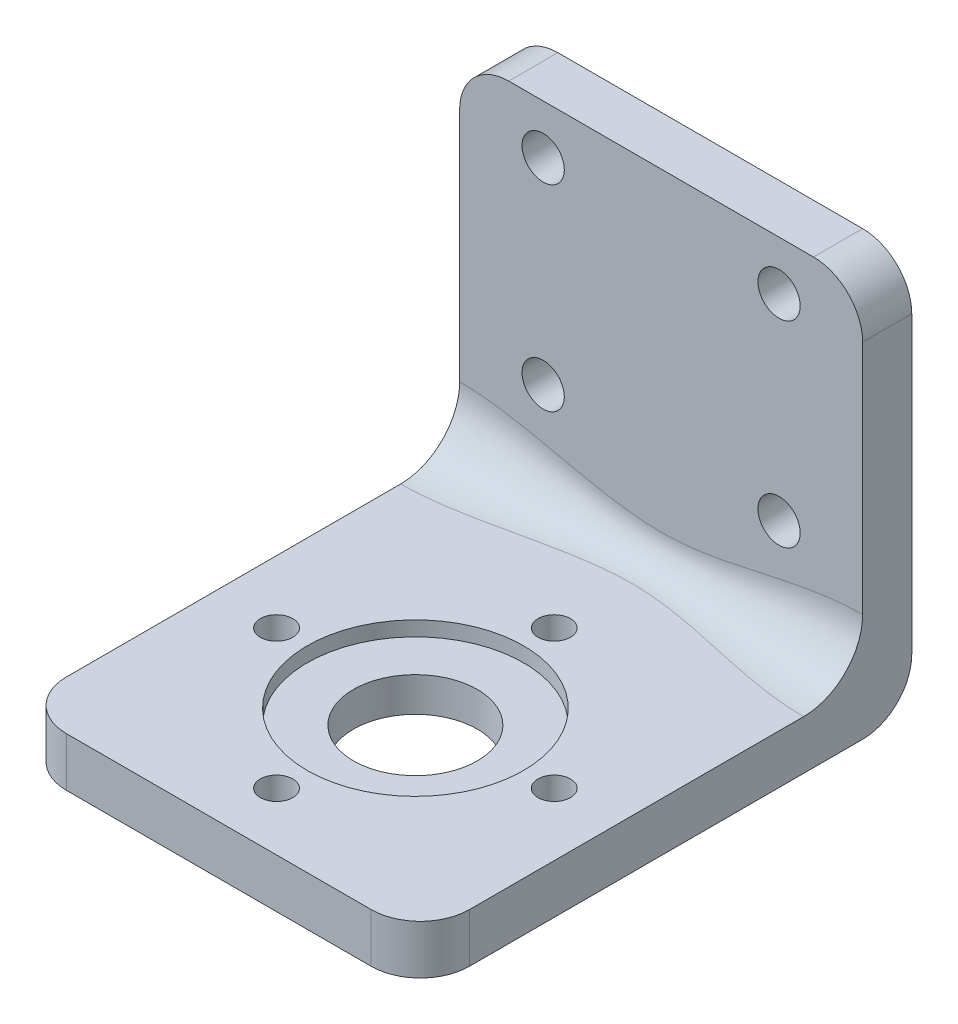
ISO-10303-21;
HEADER;
FILE_DESCRIPTION(('STEP AP214'),'2;1');
FILE_NAME('part.step','',(''),(''),'','','');
FILE_SCHEMA(('AUTOMOTIVE_DESIGN { 1 0 10303 214 1 1 1 1 }'));
ENDSEC;
DATA;
#1=APPLICATION_CONTEXT('core data for automotive mechanical design processes');
#2=APPLICATION_PROTOCOL_DEFINITION('international standard','automotive_design',2000,#1);
#3=PRODUCT_CONTEXT('',#1,'mechanical');
#4=PRODUCT('Part','Part','',(#3));
#5=PRODUCT_RELATED_PRODUCT_CATEGORY('part','',(#4));
#6=PRODUCT_DEFINITION_FORMATION('','',#4);
#7=PRODUCT_DEFINITION_CONTEXT('part definition',#1,'design');
#8=PRODUCT_DEFINITION('design','',#6,#7);
#9=PRODUCT_DEFINITION_SHAPE('','',#8);
#10=(LENGTH_UNIT() NAMED_UNIT(*) SI_UNIT(.MILLI.,.METRE.));
#11=(NAMED_UNIT(*) PLANE_ANGLE_UNIT() SI_UNIT($,.RADIAN.));
#12=(NAMED_UNIT(*) SI_UNIT($,.STERADIAN.) SOLID_ANGLE_UNIT());
#13=UNCERTAINTY_MEASURE_WITH_UNIT(LENGTH_MEASURE(1.E-05),#10,'distance_accuracy_value','');
#14=(GEOMETRIC_REPRESENTATION_CONTEXT(3) GLOBAL_UNCERTAINTY_ASSIGNED_CONTEXT((#13)) GLOBAL_UNIT_ASSIGNED_CONTEXT((#10,
#11,#12)) REPRESENTATION_CONTEXT('',''));
#15=CARTESIAN_POINT('',(0.,0.,0.));
#16=DIRECTION('',(0.,0.,1.));
#17=DIRECTION('',(1.,0.,0.));
#18=AXIS2_PLACEMENT_3D('',#15,#16,#17);
#19=CARTESIAN_POINT('',(0.,5.,0.));
#20=DIRECTION('',(0.,-1.,0.));
#21=DIRECTION('',(0.,0.,-1.));
#22=AXIS2_PLACEMENT_3D('',#19,#20,#21);
#23=PLANE('',#22);
#24=DIRECTION('',(0.,0.,-1.));
#25=VECTOR('',#24,1.);
#26=CARTESIAN_POINT('',(20.5,5.,-28.));
#27=LINE('',#26,#25);
#28=CARTESIAN_POINT('',(20.5,5.,15.));
#29=VERTEX_POINT('',#28);
#30=CARTESIAN_POINT('',(20.5,5.,-19.));
#31=VERTEX_POINT('',#30);
#32=EDGE_CURVE('E165',#29,#31,#27,.T.);
#33=ORIENTED_EDGE('',*,*,#32,.T.);
#34=CARTESIAN_POINT('',(102.5,5.,-19.));
#35=CARTESIAN_POINT('',(75.1666666666666,5.,-19.));
#36=CARTESIAN_POINT('',(47.8333333333333,5.,-19.));
#37=CARTESIAN_POINT('',(20.5,5.,-19.));
#38=CARTESIAN_POINT('',(13.6666666666667,5.,-19.));
#39=CARTESIAN_POINT('',(6.83333333333333,5.,-22.));
#40=CARTESIAN_POINT('',(0.,5.,-22.));
#41=CARTESIAN_POINT('',(-6.83333333333334,5.,-22.));
#42=CARTESIAN_POINT('',(-13.6666666666667,5.,-19.));
#43=CARTESIAN_POINT('',(-20.5,5.,-19.));
#44=CARTESIAN_POINT('',(-47.8333333333333,5.,-19.));
#45=CARTESIAN_POINT('',(-75.1666666666667,5.,-19.));
#46=CARTESIAN_POINT('',(-102.5,5.,-19.));
#47=(BOUNDED_CURVE() B_SPLINE_CURVE(3,(#34,#35,#36,#37,#38,#39,#40,#41,#42,#43,#44,#45,#46),
.UNSPECIFIED.,.F.,.F.) B_SPLINE_CURVE_WITH_KNOTS((4,3,3,3,4),(-0.1025,-0.0205,0.,0.0205,0.1025),
.UNSPECIFIED.) CURVE() GEOMETRIC_REPRESENTATION_ITEM() RATIONAL_B_SPLINE_CURVE((1.,1.,1.,1.,1.,
1.,1.,1.,1.,1.,1.,1.,1.)) REPRESENTATION_ITEM(''));
#48=CARTESIAN_POINT('',(-20.5,5.,-19.));
#49=VERTEX_POINT('',#48);
#50=EDGE_CURVE('E223',#31,#49,#47,.T.);
#51=ORIENTED_EDGE('',*,*,#50,.T.);
#52=DIRECTION('',(0.,0.,1.));
#53=VECTOR('',#52,1.);
#54=CARTESIAN_POINT('',(-20.5,5.,20.));
#55=LINE('',#54,#53);
#56=CARTESIAN_POINT('',(-20.5,5.,15.));
#57=VERTEX_POINT('',#56);
#58=EDGE_CURVE('E173',#49,#57,#55,.T.);
#59=ORIENTED_EDGE('',*,*,#58,.T.);
#60=CARTESIAN_POINT('',(-15.5,5.,15.));
#61=DIRECTION('',(0.,-1.,0.));
#62=DIRECTION('',(0.,0.,-1.));
#63=AXIS2_PLACEMENT_3D('',#60,#61,#62);
#64=CIRCLE('',#63,5.);
#65=CARTESIAN_POINT('',(-15.5,5.,20.));
#66=VERTEX_POINT('',#65);
#67=EDGE_CURVE('E194',#57,#66,#64,.F.);
#68=ORIENTED_EDGE('',*,*,#67,.T.);
#69=DIRECTION('',(1.,0.,0.));
#70=VECTOR('',#69,1.);
#71=CARTESIAN_POINT('',(20.5,5.,20.));
#72=LINE('',#71,#70);
#73=CARTESIAN_POINT('',(15.5,5.,20.));
#74=VERTEX_POINT('',#73);
#75=EDGE_CURVE('E176',#66,#74,#72,.T.);
#76=ORIENTED_EDGE('',*,*,#75,.T.);
#77=CARTESIAN_POINT('',(15.5,5.,15.));
#78=DIRECTION('',(0.,-1.,0.));
#79=DIRECTION('',(0.,0.,-1.));
#80=AXIS2_PLACEMENT_3D('',#77,#78,#79);
#81=CIRCLE('',#80,5.);
#82=EDGE_CURVE('E196',#74,#29,#81,.F.);
#83=ORIENTED_EDGE('',*,*,#82,.T.);
#84=EDGE_LOOP('',(#33,#51,#59,#68,#76,#83));
#85=FACE_BOUND('',#84,.T.);
#86=CARTESIAN_POINT('',(0.,5.,0.));
#87=DIRECTION('',(0.,1.,0.));
#88=DIRECTION('',(0.,0.,1.));
#89=AXIS2_PLACEMENT_3D('',#86,#87,#88);
#90=CIRCLE('',#89,11.);
#91=CARTESIAN_POINT('',(0.,5.,11.));
#92=VERTEX_POINT('',#91);
#93=EDGE_CURVE('E304',#92,#92,#90,.T.);
#94=ORIENTED_EDGE('',*,*,#93,.F.);
#95=EDGE_LOOP('',(#94));
#96=FACE_BOUND('',#95,.T.);
#97=CARTESIAN_POINT('',(0.,5.,-14.125));
#98=DIRECTION('',(0.,1.,0.));
#99=DIRECTION('',(0.,0.,1.));
#100=AXIS2_PLACEMENT_3D('',#97,#98,#99);
#101=CIRCLE('',#100,1.65);
#102=CARTESIAN_POINT('',(0.,5.,-12.475));
#103=VERTEX_POINT('',#102);
#104=EDGE_CURVE('E310',#103,#103,#101,.T.);
#105=ORIENTED_EDGE('',*,*,#104,.F.);
#106=EDGE_LOOP('',(#105));
#107=FACE_BOUND('',#106,.T.);
#108=CARTESIAN_POINT('',(14.125,5.,0.));
#109=DIRECTION('',(0.,1.,0.));
#110=DIRECTION('',(0.,0.,1.));
#111=AXIS2_PLACEMENT_3D('',#108,#109,#110);
#112=CIRCLE('',#111,1.65);
#113=CARTESIAN_POINT('',(14.125,5.,1.65000000000005));
#114=VERTEX_POINT('',#113);
#115=EDGE_CURVE('E314',#114,#114,#112,.T.);
#116=ORIENTED_EDGE('',*,*,#115,.F.);
#117=EDGE_LOOP('',(#116));
#118=FACE_BOUND('',#117,.T.);
#119=CARTESIAN_POINT('',(0.,5.,14.125));
#120=DIRECTION('',(0.,1.,0.));
#121=DIRECTION('',(0.,0.,1.));
#122=AXIS2_PLACEMENT_3D('',#119,#120,#121);
#123=CIRCLE('',#122,1.65);
#124=CARTESIAN_POINT('',(0.,5.,15.775));
#125=VERTEX_POINT('',#124);
#126=EDGE_CURVE('E320',#125,#125,#123,.T.);
#127=ORIENTED_EDGE('',*,*,#126,.F.);
#128=EDGE_LOOP('',(#127));
#129=FACE_BOUND('',#128,.T.);
#130=CARTESIAN_POINT('',(-14.125,5.,-1.47951521733478E-13));
#131=DIRECTION('',(0.,1.,0.));
#132=DIRECTION('',(0.,0.,1.));
#133=AXIS2_PLACEMENT_3D('',#130,#131,#132);
#134=CIRCLE('',#133,1.65);
#135=CARTESIAN_POINT('',(-14.125,5.,1.64999999999985));
#136=VERTEX_POINT('',#135);
#137=EDGE_CURVE('E326',#136,#136,#134,.T.);
#138=ORIENTED_EDGE('',*,*,#137,.F.);
#139=EDGE_LOOP('',(#138));
#140=FACE_BOUND('',#139,.T.);
#141=ADVANCED_FACE('F49',(#85,#96,#107,#118,#129,#140),#23,.F.);
#142=CARTESIAN_POINT('',(0.,0.,0.));
#143=DIRECTION('',(0.,-1.,0.));
#144=DIRECTION('',(0.,0.,-1.));
#145=AXIS2_PLACEMENT_3D('',#142,#143,#144);
#146=PLANE('',#145);
#147=DIRECTION('',(0.,0.,-1.));
#148=VECTOR('',#147,1.);
#149=CARTESIAN_POINT('',(20.5,0.,-28.));
#150=LINE('',#149,#148);
#151=CARTESIAN_POINT('',(20.5,0.,15.));
#152=VERTEX_POINT('',#151);
#153=CARTESIAN_POINT('',(20.5,0.,-25.));
#154=VERTEX_POINT('',#153);
#155=EDGE_CURVE('E162',#152,#154,#150,.T.);
#156=ORIENTED_EDGE('',*,*,#155,.F.);
#157=CARTESIAN_POINT('',(15.5,0.,15.));
#158=DIRECTION('',(0.,-1.,0.));
#159=DIRECTION('',(0.,0.,-1.));
#160=AXIS2_PLACEMENT_3D('',#157,#158,#159);
#161=CIRCLE('',#160,5.);
#162=CARTESIAN_POINT('',(15.5,0.,20.));
#163=VERTEX_POINT('',#162);
#164=EDGE_CURVE('E145',#152,#163,#161,.T.);
#165=ORIENTED_EDGE('',*,*,#164,.T.);
#166=DIRECTION('',(1.,0.,0.));
#167=VECTOR('',#166,1.);
#168=CARTESIAN_POINT('',(20.5,0.,20.));
#169=LINE('',#168,#167);
#170=CARTESIAN_POINT('',(-15.5,0.,20.));
#171=VERTEX_POINT('',#170);
#172=EDGE_CURVE('E174',#171,#163,#169,.T.);
#173=ORIENTED_EDGE('',*,*,#172,.F.);
#174=CARTESIAN_POINT('',(-15.5,0.,15.));
#175=DIRECTION('',(0.,-1.,0.));
#176=DIRECTION('',(0.,0.,-1.));
#177=AXIS2_PLACEMENT_3D('',#174,#175,#176);
#178=CIRCLE('',#177,5.);
#179=CARTESIAN_POINT('',(-20.5,0.,15.));
#180=VERTEX_POINT('',#179);
#181=EDGE_CURVE('E156',#171,#180,#178,.T.);
#182=ORIENTED_EDGE('',*,*,#181,.T.);
#183=DIRECTION('',(0.,0.,1.));
#184=VECTOR('',#183,1.);
#185=CARTESIAN_POINT('',(-20.5,0.,20.));
#186=LINE('',#185,#184);
#187=CARTESIAN_POINT('',(-20.5,0.,-25.));
#188=VERTEX_POINT('',#187);
#189=EDGE_CURVE('E178',#188,#180,#186,.T.);
#190=ORIENTED_EDGE('',*,*,#189,.F.);
#191=DIRECTION('',(-1.,0.,0.));
#192=VECTOR('',#191,1.);
#193=CARTESIAN_POINT('',(0.,0.,-25.));
#194=LINE('',#193,#192);
#195=EDGE_CURVE('E166',#188,#154,#194,.F.);
#196=ORIENTED_EDGE('',*,*,#195,.T.);
#197=EDGE_LOOP('',(#156,#165,#173,#182,#190,#196));
#198=FACE_BOUND('',#197,.T.);
#199=CARTESIAN_POINT('',(0.,0.,14.125));
#200=DIRECTION('',(0.,1.,0.));
#201=DIRECTION('',(0.,0.,1.));
#202=AXIS2_PLACEMENT_3D('',#199,#200,#201);
#203=CIRCLE('',#202,1.65);
#204=CARTESIAN_POINT('',(0.,0.,15.775));
#205=VERTEX_POINT('',#204);
#206=EDGE_CURVE('E323',#205,#205,#203,.T.);
#207=ORIENTED_EDGE('',*,*,#206,.T.);
#208=EDGE_LOOP('',(#207));
#209=FACE_BOUND('',#208,.T.);
#210=CARTESIAN_POINT('',(0.,0.,-14.125));
#211=DIRECTION('',(0.,1.,0.));
#212=DIRECTION('',(0.,0.,1.));
#213=AXIS2_PLACEMENT_3D('',#210,#211,#212);
#214=CIRCLE('',#213,1.65);
#215=CARTESIAN_POINT('',(0.,0.,-12.475));
#216=VERTEX_POINT('',#215);
#217=EDGE_CURVE('E311',#216,#216,#214,.T.);
#218=ORIENTED_EDGE('',*,*,#217,.T.);
#219=EDGE_LOOP('',(#218));
#220=FACE_BOUND('',#219,.T.);
#221=CARTESIAN_POINT('',(14.125,0.,0.));
#222=DIRECTION('',(0.,1.,0.));
#223=DIRECTION('',(0.,0.,1.));
#224=AXIS2_PLACEMENT_3D('',#221,#222,#223);
#225=CIRCLE('',#224,1.65);
#226=CARTESIAN_POINT('',(14.125,0.,1.65000000000005));
#227=VERTEX_POINT('',#226);
#228=EDGE_CURVE('E317',#227,#227,#225,.T.);
#229=ORIENTED_EDGE('',*,*,#228,.T.);
#230=EDGE_LOOP('',(#229));
#231=FACE_BOUND('',#230,.T.);
#232=CARTESIAN_POINT('',(-14.125,0.,-1.47951521733478E-13));
#233=DIRECTION('',(0.,1.,0.));
#234=DIRECTION('',(0.,0.,1.));
#235=AXIS2_PLACEMENT_3D('',#232,#233,#234);
#236=CIRCLE('',#235,1.65);
#237=CARTESIAN_POINT('',(-14.125,0.,1.64999999999985));
#238=VERTEX_POINT('',#237);
#239=EDGE_CURVE('E329',#238,#238,#236,.T.);
#240=ORIENTED_EDGE('',*,*,#239,.T.);
#241=EDGE_LOOP('',(#240));
#242=FACE_BOUND('',#241,.T.);
#243=CARTESIAN_POINT('',(0.,0.,0.));
#244=DIRECTION('',(0.,1.,0.));
#245=DIRECTION('',(0.,0.,1.));
#246=AXIS2_PLACEMENT_3D('',#243,#244,#245);
#247=CIRCLE('',#246,6.3);
#248=CARTESIAN_POINT('',(0.,0.,6.3));
#249=VERTEX_POINT('',#248);
#250=EDGE_CURVE('E335',#249,#249,#247,.T.);
#251=ORIENTED_EDGE('',*,*,#250,.T.);
#252=EDGE_LOOP('',(#251));
#253=FACE_BOUND('',#252,.T.);
#254=ADVANCED_FACE('F169',(#198,#209,#220,#231,#242,#253),#146,.T.);
#255=CARTESIAN_POINT('',(-20.5,5.,20.));
#256=DIRECTION('',(1.,0.,0.));
#257=DIRECTION('',(0.,0.,-1.));
#258=AXIS2_PLACEMENT_3D('',#255,#256,#257);
#259=PLANE('',#258);
#260=ORIENTED_EDGE('',*,*,#58,.F.);
#261=CARTESIAN_POINT('',(-20.5,5.,-19.));
#262=CARTESIAN_POINT('',(-20.5,4.99998185319682,-19.1687563537996));
#263=CARTESIAN_POINT('',(-20.5,5.00711891499115,-19.3375101029604));
#264=CARTESIAN_POINT('',(-20.5,5.0355723897027,-19.6738102077422));
#265=CARTESIAN_POINT('',(-20.5,5.05688812244296,-19.8413566208916));
#266=CARTESIAN_POINT('',(-20.5,5.11354648216325,-20.1739305915643));
#267=CARTESIAN_POINT('',(-20.5,5.14887849800397,-20.3389599567175));
#268=CARTESIAN_POINT('',(-20.5,5.2333124043798,-20.6654554225954));
#269=CARTESIAN_POINT('',(-20.5,5.28241412682549,-20.8269215667911));
#270=CARTESIAN_POINT('',(-20.5,5.39405728527187,-21.1451937792472));
#271=CARTESIAN_POINT('',(-20.5,5.45660279266905,-21.3019984193779));
#272=CARTESIAN_POINT('',(-20.5,5.59470522710627,-21.609838703918));
#273=CARTESIAN_POINT('',(-20.5,5.67026693815366,-21.7608722021616));
#274=CARTESIAN_POINT('',(-20.5,5.83380474458107,-22.0559558653354));
#275=CARTESIAN_POINT('',(-20.5,5.92177418699462,-22.2000097174649));
#276=CARTESIAN_POINT('',(-20.5,6.10956546883596,-22.4802455879841));
#277=CARTESIAN_POINT('',(-20.5,6.20939141773711,-22.6164248525774));
#278=CARTESIAN_POINT('',(-20.5,6.42014206607361,-22.8798647142634));
#279=CARTESIAN_POINT('',(-20.5,6.53106472468132,-23.0071269440195));
#280=CARTESIAN_POINT('',(-20.5,6.76323562781716,-23.2518556596365));
#281=CARTESIAN_POINT('',(-20.5,6.88448387343979,-23.369322144459));
#282=CARTESIAN_POINT('',(-20.5,7.13649077482601,-23.5936658863369));
#283=CARTESIAN_POINT('',(-20.5,7.26725292764923,-23.7005392151821));
#284=CARTESIAN_POINT('',(-20.5,7.53727079643672,-23.902851913268));
#285=CARTESIAN_POINT('',(-20.5,7.67652355004665,-23.9982952363547));
#286=CARTESIAN_POINT('',(-20.5,7.96265332207706,-24.1771619594503));
#287=CARTESIAN_POINT('',(-20.5,8.109534502019,-24.2605787029136));
#288=CARTESIAN_POINT('',(-20.5,8.40974844632281,-24.41470773829));
#289=CARTESIAN_POINT('',(-20.5,8.56307884602161,-24.4854246374504));
#290=CARTESIAN_POINT('',(-20.5,8.87511425492029,-24.6136707230681));
#291=CARTESIAN_POINT('',(-20.5,9.03381771578294,-24.6712036721947));
#292=CARTESIAN_POINT('',(-20.5,9.35544410149749,-24.7726842059971));
#293=CARTESIAN_POINT('',(-20.5,9.51836600183349,-24.8166350563782));
#294=CARTESIAN_POINT('',(-20.5,9.89895584736189,-24.9022615118628));
#295=CARTESIAN_POINT('',(-20.5,10.1177870427925,-24.9389122329387));
#296=CARTESIAN_POINT('',(-20.5,10.4477910012266,-24.975560615492));
#297=CARTESIAN_POINT('',(-20.5,10.5580293043512,-24.9847221184334));
#298=CARTESIAN_POINT('',(-20.5,10.7788360343227,-24.9969410558667));
#299=CARTESIAN_POINT('',(-20.5,10.8894044376644,-24.9999989150633));
#300=CARTESIAN_POINT('',(-20.5,11.,-25.));
#301=B_SPLINE_CURVE_WITH_KNOTS('',3,(#261,#262,#263,#264,#265,#266,#267,#268,#269,#270,#271,
#272,#273,#274,#275,#276,#277,#278,#279,#280,#281,#282,#283,#284,#285,#286,#287,#288,#289,#290,
#291,#292,#293,#294,#295,#296,#297,#298,#299,#300),.UNSPECIFIED.,.F.,.F.,(4,2,2,2,2,2,2,2,2,2,2,
2,2,2,2,2,2,2,2,4),(0.,0.506114535320528,1.01220479314574,1.51791264023729,2.02361431432596,
2.52946935446871,3.03551071606248,3.54128176496753,4.04722862885895,4.55308261308199,
5.05893665092544,5.56497757590775,6.07084294341928,6.57698723429621,7.08294753366735,
7.58876325278334,8.09445725782553,8.75855077526273,9.09026407937799,9.42195430136597),.UNSPECIFIED.);
#302=CARTESIAN_POINT('',(-20.5,11.,-25.));
#303=VERTEX_POINT('',#302);
#304=EDGE_CURVE('E66',#49,#303,#301,.T.);
#305=ORIENTED_EDGE('',*,*,#304,.T.);
#306=DIRECTION('',(0.,1.,0.));
#307=VECTOR('',#306,1.);
#308=CARTESIAN_POINT('',(-20.5,-41.3037528561268,-25.));
#309=LINE('',#308,#307);
#310=CARTESIAN_POINT('',(-20.5,35.,-25.));
#311=VERTEX_POINT('',#310);
#312=EDGE_CURVE('E338',#303,#311,#309,.T.);
#313=ORIENTED_EDGE('',*,*,#312,.T.);
#314=DIRECTION('',(0.,0.,1.));
#315=VECTOR('',#314,1.);
#316=CARTESIAN_POINT('',(-20.5,35.,-30.));
#317=LINE('',#316,#315);
#318=CARTESIAN_POINT('',(-20.5,35.,-30.));
#319=VERTEX_POINT('',#318);
#320=EDGE_CURVE('E221',#311,#319,#317,.F.);
#321=ORIENTED_EDGE('',*,*,#320,.T.);
#322=DIRECTION('',(0.,1.,0.));
#323=VECTOR('',#322,1.);
#324=CARTESIAN_POINT('',(-20.5,-41.3037528561268,-30.));
#325=LINE('',#324,#323);
#326=CARTESIAN_POINT('',(-20.5,5.,-30.));
#327=VERTEX_POINT('',#326);
#328=EDGE_CURVE('E342',#327,#319,#325,.T.);
#329=ORIENTED_EDGE('',*,*,#328,.F.);
#330=CARTESIAN_POINT('',(-20.5,5.,-25.));
#331=DIRECTION('',(1.,0.,0.));
#332=DIRECTION('',(0.,0.,-1.));
#333=AXIS2_PLACEMENT_3D('',#330,#331,#332);
#334=CIRCLE('',#333,5.);
#335=EDGE_CURVE('E216',#327,#188,#334,.F.);
#336=ORIENTED_EDGE('',*,*,#335,.T.);
#337=ORIENTED_EDGE('',*,*,#189,.T.);
#338=DIRECTION('',(0.,-1.,0.));
#339=VECTOR('',#338,1.);
#340=CARTESIAN_POINT('',(-20.5,5.,15.));
#341=LINE('',#340,#339);
#342=EDGE_CURVE('E218',#180,#57,#341,.F.);
#343=ORIENTED_EDGE('',*,*,#342,.T.);
#344=EDGE_LOOP('',(#260,#305,#313,#321,#329,#336,#337,#343));
#345=FACE_BOUND('',#344,.T.);
#346=ADVANCED_FACE('F241',(#345),#259,.F.);
#347=CARTESIAN_POINT('',(20.5,5.,20.));
#348=DIRECTION('',(0.,0.,-1.));
#349=DIRECTION('',(-1.,0.,0.));
#350=AXIS2_PLACEMENT_3D('',#347,#348,#349);
#351=PLANE('',#350);
#352=ORIENTED_EDGE('',*,*,#172,.T.);
#353=DIRECTION('',(0.,-1.,0.));
#354=VECTOR('',#353,1.);
#355=CARTESIAN_POINT('',(15.5,5.,20.));
#356=LINE('',#355,#354);
#357=EDGE_CURVE('E150',#163,#74,#356,.F.);
#358=ORIENTED_EDGE('',*,*,#357,.T.);
#359=ORIENTED_EDGE('',*,*,#75,.F.);
#360=DIRECTION('',(0.,-1.,0.));
#361=VECTOR('',#360,1.);
#362=CARTESIAN_POINT('',(-15.5,5.,20.));
#363=LINE('',#362,#361);
#364=EDGE_CURVE('E155',#66,#171,#363,.T.);
#365=ORIENTED_EDGE('',*,*,#364,.T.);
#366=EDGE_LOOP('',(#352,#358,#359,#365));
#367=FACE_BOUND('',#366,.T.);
#368=ADVANCED_FACE('F246',(#367),#351,.F.);
#369=CARTESIAN_POINT('',(20.5,5.,-28.));
#370=DIRECTION('',(-1.,0.,0.));
#371=DIRECTION('',(0.,0.,1.));
#372=AXIS2_PLACEMENT_3D('',#369,#370,#371);
#373=PLANE('',#372);
#374=ORIENTED_EDGE('',*,*,#32,.F.);
#375=DIRECTION('',(0.,-1.,0.));
#376=VECTOR('',#375,1.);
#377=CARTESIAN_POINT('',(20.5,5.,15.));
#378=LINE('',#377,#376);
#379=EDGE_CURVE('E149',#29,#152,#378,.T.);
#380=ORIENTED_EDGE('',*,*,#379,.T.);
#381=ORIENTED_EDGE('',*,*,#155,.T.);
#382=CARTESIAN_POINT('',(20.5,5.,-25.));
#383=DIRECTION('',(-1.,0.,0.));
#384=DIRECTION('',(0.,0.,1.));
#385=AXIS2_PLACEMENT_3D('',#382,#383,#384);
#386=CIRCLE('',#385,5.);
#387=CARTESIAN_POINT('',(20.5,5.,-30.));
#388=VERTEX_POINT('',#387);
#389=EDGE_CURVE('E185',#154,#388,#386,.F.);
#390=ORIENTED_EDGE('',*,*,#389,.T.);
#391=DIRECTION('',(0.,1.,0.));
#392=VECTOR('',#391,1.);
#393=CARTESIAN_POINT('',(20.5,-41.3037528561268,-30.));
#394=LINE('',#393,#392);
#395=CARTESIAN_POINT('',(20.5,35.,-30.));
#396=VERTEX_POINT('',#395);
#397=EDGE_CURVE('E345',#388,#396,#394,.T.);
#398=ORIENTED_EDGE('',*,*,#397,.T.);
#399=DIRECTION('',(0.,0.,-1.));
#400=VECTOR('',#399,1.);
#401=CARTESIAN_POINT('',(20.5,35.,-25.));
#402=LINE('',#401,#400);
#403=CARTESIAN_POINT('',(20.5,35.,-25.));
#404=VERTEX_POINT('',#403);
#405=EDGE_CURVE('E167',#396,#404,#402,.F.);
#406=ORIENTED_EDGE('',*,*,#405,.T.);
#407=DIRECTION('',(0.,1.,0.));
#408=VECTOR('',#407,1.);
#409=CARTESIAN_POINT('',(20.5,-41.3037528561268,-25.));
#410=LINE('',#409,#408);
#411=CARTESIAN_POINT('',(20.5,11.,-25.));
#412=VERTEX_POINT('',#411);
#413=EDGE_CURVE('E343',#412,#404,#410,.T.);
#414=ORIENTED_EDGE('',*,*,#413,.F.);
#415=CARTESIAN_POINT('',(20.5,11.,-25.));
#416=CARTESIAN_POINT('',(20.5,10.8312436462004,-25.0000181468032));
#417=CARTESIAN_POINT('',(20.5,10.6624898970396,-24.9928810850088));
#418=CARTESIAN_POINT('',(20.5,10.3261897922578,-24.9644276102973));
#419=CARTESIAN_POINT('',(20.5,10.1586433791084,-24.943111877557));
#420=CARTESIAN_POINT('',(20.5,9.82606940843566,-24.8864535178368));
#421=CARTESIAN_POINT('',(20.5,9.66104004328253,-24.851121501996));
#422=CARTESIAN_POINT('',(20.5,9.33454457740465,-24.7666875956202));
#423=CARTESIAN_POINT('',(20.5,9.17307843320894,-24.7175858731745));
#424=CARTESIAN_POINT('',(20.5,8.85480622075284,-24.6059427147281));
#425=CARTESIAN_POINT('',(20.5,8.69800158062211,-24.5433972073309));
#426=CARTESIAN_POINT('',(20.5,8.39016129608198,-24.4052947728937));
#427=CARTESIAN_POINT('',(20.5,8.23912779783842,-24.3297330618463));
#428=CARTESIAN_POINT('',(20.5,7.94404413466466,-24.1661952554189));
#429=CARTESIAN_POINT('',(20.5,7.79999028253509,-24.0782258130054));
#430=CARTESIAN_POINT('',(20.5,7.51975441201594,-23.890434531164));
#431=CARTESIAN_POINT('',(20.5,7.38357514742257,-23.7906085822629));
#432=CARTESIAN_POINT('',(20.5,7.12013528573658,-23.5798579339264));
#433=CARTESIAN_POINT('',(20.5,6.99287305598049,-23.4689352753187));
#434=CARTESIAN_POINT('',(20.5,6.74814434036354,-23.2367643721828));
#435=CARTESIAN_POINT('',(20.5,6.63067785554102,-23.1155161265602));
#436=CARTESIAN_POINT('',(20.5,6.40633411366312,-22.863509225174));
#437=CARTESIAN_POINT('',(20.5,6.29946078481791,-22.7327470723508));
#438=CARTESIAN_POINT('',(20.5,6.09714808673204,-22.4627292035633));
#439=CARTESIAN_POINT('',(20.5,6.00170476364533,-22.3234764499534));
#440=CARTESIAN_POINT('',(20.5,5.82283804054973,-22.0373466779229));
#441=CARTESIAN_POINT('',(20.5,5.73942129708636,-21.890465497981));
#442=CARTESIAN_POINT('',(20.5,5.58529226170997,-21.5902515536772));
#443=CARTESIAN_POINT('',(20.5,5.51457536254961,-21.4369211539784));
#444=CARTESIAN_POINT('',(20.5,5.38632927693188,-21.1248857450797));
#445=CARTESIAN_POINT('',(20.5,5.3287963278053,-20.9661822842171));
#446=CARTESIAN_POINT('',(20.5,5.22731579400287,-20.6445558985025));
#447=CARTESIAN_POINT('',(20.5,5.18336494362181,-20.4816339981665));
#448=CARTESIAN_POINT('',(20.5,5.0977384881372,-20.1010441526381));
#449=CARTESIAN_POINT('',(20.5,5.06108776706127,-19.8822129572075));
#450=CARTESIAN_POINT('',(20.5,5.02443938450798,-19.5522089987734));
#451=CARTESIAN_POINT('',(20.5,5.01527788156664,-19.4419706956488));
#452=CARTESIAN_POINT('',(20.5,5.00305894413331,-19.2211639656773));
#453=CARTESIAN_POINT('',(20.5,5.00000108493671,-19.1105955623356));
#454=CARTESIAN_POINT('',(20.5,5.,-19.));
#455=B_SPLINE_CURVE_WITH_KNOTS('',3,(#415,#416,#417,#418,#419,#420,#421,#422,#423,#424,#425,
#426,#427,#428,#429,#430,#431,#432,#433,#434,#435,#436,#437,#438,#439,#440,#441,#442,#443,#444,
#445,#446,#447,#448,#449,#450,#451,#452,#453,#454),.UNSPECIFIED.,.F.,.F.,(4,2,2,2,2,2,2,2,2,2,2,
2,2,2,2,2,2,2,2,4),(0.,0.506114535320528,1.01220479314574,1.51791264023729,2.02361431432595,
2.52946935446871,3.03551071606248,3.54128176496752,4.04722862885895,4.55308261308199,
5.05893665092545,5.56497757590775,6.07084294341929,6.57698723429621,7.08294753366735,
7.58876325278334,8.09445725782553,8.75855077526273,9.09026407937799,9.42195430136597),.UNSPECIFIED.);
#456=EDGE_CURVE('E12',#412,#31,#455,.T.);
#457=ORIENTED_EDGE('',*,*,#456,.T.);
#458=EDGE_LOOP('',(#374,#380,#381,#390,#398,#406,#414,#457));
#459=FACE_BOUND('',#458,.T.);
#460=ADVANCED_FACE('F161',(#459),#373,.F.);
#461=CARTESIAN_POINT('',(0.,5.,0.));
#462=DIRECTION('',(0.,-1.,0.));
#463=DIRECTION('',(0.,0.,-1.));
#464=AXIS2_PLACEMENT_3D('',#461,#462,#463);
#465=CYLINDRICAL_SURFACE('',#464,11.);
#466=CARTESIAN_POINT('',(0.,3.5,0.));
#467=DIRECTION('',(0.,1.,0.));
#468=DIRECTION('',(0.,0.,1.));
#469=AXIS2_PLACEMENT_3D('',#466,#467,#468);
#470=CIRCLE('',#469,11.);
#471=CARTESIAN_POINT('',(0.,3.5,11.));
#472=VERTEX_POINT('',#471);
#473=EDGE_CURVE('E182',#472,#472,#470,.T.);
#474=ORIENTED_EDGE('',*,*,#473,.F.);
#475=EDGE_LOOP('',(#474));
#476=FACE_BOUND('',#475,.T.);
#477=ORIENTED_EDGE('',*,*,#93,.T.);
#478=EDGE_LOOP('',(#477));
#479=FACE_BOUND('',#478,.T.);
#480=ADVANCED_FACE('F282',(#476,#479),#465,.F.);
#481=CARTESIAN_POINT('',(0.,5.,-14.125));
#482=DIRECTION('',(0.,-1.,0.));
#483=DIRECTION('',(0.,0.,-1.));
#484=AXIS2_PLACEMENT_3D('',#481,#482,#483);
#485=CYLINDRICAL_SURFACE('',#484,1.65);
#486=ORIENTED_EDGE('',*,*,#104,.T.);
#487=EDGE_LOOP('',(#486));
#488=FACE_BOUND('',#487,.T.);
#489=ORIENTED_EDGE('',*,*,#217,.F.);
#490=EDGE_LOOP('',(#489));
#491=FACE_BOUND('',#490,.T.);
#492=ADVANCED_FACE('F290',(#488,#491),#485,.F.);
#493=CARTESIAN_POINT('',(14.125,5.,0.));
#494=DIRECTION('',(0.,-1.,0.));
#495=DIRECTION('',(0.,0.,-1.));
#496=AXIS2_PLACEMENT_3D('',#493,#494,#495);
#497=CYLINDRICAL_SURFACE('',#496,1.65);
#498=ORIENTED_EDGE('',*,*,#115,.T.);
#499=EDGE_LOOP('',(#498));
#500=FACE_BOUND('',#499,.T.);
#501=ORIENTED_EDGE('',*,*,#228,.F.);
#502=EDGE_LOOP('',(#501));
#503=FACE_BOUND('',#502,.T.);
#504=ADVANCED_FACE('F442',(#500,#503),#497,.F.);
#505=CARTESIAN_POINT('',(0.,5.,14.125));
#506=DIRECTION('',(0.,-1.,0.));
#507=DIRECTION('',(0.,0.,-1.));
#508=AXIS2_PLACEMENT_3D('',#505,#506,#507);
#509=CYLINDRICAL_SURFACE('',#508,1.65);
#510=ORIENTED_EDGE('',*,*,#126,.T.);
#511=EDGE_LOOP('',(#510));
#512=FACE_BOUND('',#511,.T.);
#513=ORIENTED_EDGE('',*,*,#206,.F.);
#514=EDGE_LOOP('',(#513));
#515=FACE_BOUND('',#514,.T.);
#516=ADVANCED_FACE('F438',(#512,#515),#509,.F.);
#517=CARTESIAN_POINT('',(-14.125,5.,-1.47951521733478E-13));
#518=DIRECTION('',(0.,-1.,0.));
#519=DIRECTION('',(0.,0.,-1.));
#520=AXIS2_PLACEMENT_3D('',#517,#518,#519);
#521=CYLINDRICAL_SURFACE('',#520,1.65);
#522=ORIENTED_EDGE('',*,*,#137,.T.);
#523=EDGE_LOOP('',(#522));
#524=FACE_BOUND('',#523,.T.);
#525=ORIENTED_EDGE('',*,*,#239,.F.);
#526=EDGE_LOOP('',(#525));
#527=FACE_BOUND('',#526,.T.);
#528=ADVANCED_FACE('F434',(#524,#527),#521,.F.);
#529=CARTESIAN_POINT('',(0.,3.5,0.));
#530=DIRECTION('',(0.,1.,0.));
#531=DIRECTION('',(0.,0.,1.));
#532=AXIS2_PLACEMENT_3D('',#529,#530,#531);
#533=PLANE('',#532);
#534=ORIENTED_EDGE('',*,*,#473,.T.);
#535=EDGE_LOOP('',(#534));
#536=FACE_BOUND('',#535,.T.);
#537=CARTESIAN_POINT('',(0.,3.5,0.));
#538=DIRECTION('',(0.,1.,0.));
#539=DIRECTION('',(0.,0.,1.));
#540=AXIS2_PLACEMENT_3D('',#537,#538,#539);
#541=CIRCLE('',#540,6.3);
#542=CARTESIAN_POINT('',(0.,3.5,6.3));
#543=VERTEX_POINT('',#542);
#544=EDGE_CURVE('E332',#543,#543,#541,.T.);
#545=ORIENTED_EDGE('',*,*,#544,.F.);
#546=EDGE_LOOP('',(#545));
#547=FACE_BOUND('',#546,.T.);
#548=ADVANCED_FACE('F430',(#536,#547),#533,.T.);
#549=CARTESIAN_POINT('',(0.,3.5,0.));
#550=DIRECTION('',(0.,-1.,0.));
#551=DIRECTION('',(0.,0.,-1.));
#552=AXIS2_PLACEMENT_3D('',#549,#550,#551);
#553=CYLINDRICAL_SURFACE('',#552,6.3);
#554=ORIENTED_EDGE('',*,*,#544,.T.);
#555=EDGE_LOOP('',(#554));
#556=FACE_BOUND('',#555,.T.);
#557=ORIENTED_EDGE('',*,*,#250,.F.);
#558=EDGE_LOOP('',(#557));
#559=FACE_BOUND('',#558,.T.);
#560=ADVANCED_FACE('F426',(#556,#559),#553,.F.);
#561=CARTESIAN_POINT('',(-20.5,-41.3037528561268,-25.));
#562=DIRECTION('',(0.,0.,1.));
#563=DIRECTION('',(1.,0.,0.));
#564=AXIS2_PLACEMENT_3D('',#561,#562,#563);
#565=PLANE('',#564);
#566=CARTESIAN_POINT('',(12.,15.,-25.));
#567=DIRECTION('',(0.,0.,1.));
#568=DIRECTION('',(1.,0.,0.));
#569=AXIS2_PLACEMENT_3D('',#566,#567,#568);
#570=CIRCLE('',#569,2.15);
#571=CARTESIAN_POINT('',(14.15,15.,-25.));
#572=VERTEX_POINT('',#571);
#573=EDGE_CURVE('E366',#572,#572,#570,.F.);
#574=ORIENTED_EDGE('',*,*,#573,.T.);
#575=EDGE_LOOP('',(#574));
#576=FACE_BOUND('',#575,.T.);
#577=CARTESIAN_POINT('',(-12.,15.,-25.));
#578=DIRECTION('',(0.,0.,1.));
#579=DIRECTION('',(1.,0.,0.));
#580=AXIS2_PLACEMENT_3D('',#577,#578,#579);
#581=CIRCLE('',#580,2.15);
#582=CARTESIAN_POINT('',(-9.85000000000001,15.,-25.));
#583=VERTEX_POINT('',#582);
#584=EDGE_CURVE('E372',#583,#583,#581,.F.);
#585=ORIENTED_EDGE('',*,*,#584,.T.);
#586=EDGE_LOOP('',(#585));
#587=FACE_BOUND('',#586,.T.);
#588=CARTESIAN_POINT('',(-12.,35.,-25.));
#589=DIRECTION('',(0.,0.,1.));
#590=DIRECTION('',(1.,0.,0.));
#591=AXIS2_PLACEMENT_3D('',#588,#589,#590);
#592=CIRCLE('',#591,2.15);
#593=CARTESIAN_POINT('',(-9.85,35.,-25.));
#594=VERTEX_POINT('',#593);
#595=EDGE_CURVE('E360',#594,#594,#592,.F.);
#596=ORIENTED_EDGE('',*,*,#595,.T.);
#597=EDGE_LOOP('',(#596));
#598=FACE_BOUND('',#597,.T.);
#599=CARTESIAN_POINT('',(12.,35.,-25.));
#600=DIRECTION('',(0.,0.,1.));
#601=DIRECTION('',(1.,0.,0.));
#602=AXIS2_PLACEMENT_3D('',#599,#600,#601);
#603=CIRCLE('',#602,2.15);
#604=CARTESIAN_POINT('',(14.15,35.,-25.));
#605=VERTEX_POINT('',#604);
#606=EDGE_CURVE('E357',#605,#605,#603,.F.);
#607=ORIENTED_EDGE('',*,*,#606,.T.);
#608=EDGE_LOOP('',(#607));
#609=FACE_BOUND('',#608,.T.);
#610=ORIENTED_EDGE('',*,*,#312,.F.);
#611=CARTESIAN_POINT('',(102.5,11.,-25.));
#612=CARTESIAN_POINT('',(75.1666666666666,11.,-25.));
#613=CARTESIAN_POINT('',(47.8333333333333,11.,-25.));
#614=CARTESIAN_POINT('',(20.5,11.,-25.));
#615=CARTESIAN_POINT('',(13.6666666666667,11.,-25.));
#616=CARTESIAN_POINT('',(6.83333333333333,8.,-25.));
#617=CARTESIAN_POINT('',(0.,8.,-25.));
#618=CARTESIAN_POINT('',(-6.83333333333334,8.,-25.));
#619=CARTESIAN_POINT('',(-13.6666666666667,11.,-25.));
#620=CARTESIAN_POINT('',(-20.5,11.,-25.));
#621=CARTESIAN_POINT('',(-47.8333333333333,11.,-25.));
#622=CARTESIAN_POINT('',(-75.1666666666667,11.,-25.));
#623=CARTESIAN_POINT('',(-102.5,11.,-25.));
#624=(BOUNDED_CURVE() B_SPLINE_CURVE(3,(#611,#612,#613,#614,#615,#616,#617,#618,#619,#620,#621,
#622,#623),.UNSPECIFIED.,.F.,.F.) B_SPLINE_CURVE_WITH_KNOTS((4,3,3,3,4),(-0.1025,-0.0205,0.,
0.0205,0.1025),
.UNSPECIFIED.) CURVE() GEOMETRIC_REPRESENTATION_ITEM() RATIONAL_B_SPLINE_CURVE((1.,1.,1.,1.,1.,
1.,1.,1.,1.,1.,1.,1.,1.)) REPRESENTATION_ITEM(''));
#625=EDGE_CURVE('E79',#303,#412,#624,.F.);
#626=ORIENTED_EDGE('',*,*,#625,.T.);
#627=ORIENTED_EDGE('',*,*,#413,.T.);
#628=CARTESIAN_POINT('',(15.5,35.,-25.));
#629=DIRECTION('',(0.,0.,1.));
#630=DIRECTION('',(1.,0.,0.));
#631=AXIS2_PLACEMENT_3D('',#628,#629,#630);
#632=CIRCLE('',#631,5.);
#633=CARTESIAN_POINT('',(15.5,40.,-25.));
#634=VERTEX_POINT('',#633);
#635=EDGE_CURVE('E214',#404,#634,#632,.T.);
#636=ORIENTED_EDGE('',*,*,#635,.T.);
#637=DIRECTION('',(1.,0.,0.));
#638=VECTOR('',#637,1.);
#639=CARTESIAN_POINT('',(-20.5,40.,-25.));
#640=LINE('',#639,#638);
#641=CARTESIAN_POINT('',(-15.5,40.,-25.));
#642=VERTEX_POINT('',#641);
#643=EDGE_CURVE('E353',#642,#634,#640,.T.);
#644=ORIENTED_EDGE('',*,*,#643,.F.);
#645=CARTESIAN_POINT('',(-15.5,35.,-25.));
#646=DIRECTION('',(0.,0.,1.));
#647=DIRECTION('',(1.,0.,0.));
#648=AXIS2_PLACEMENT_3D('',#645,#646,#647);
#649=CIRCLE('',#648,5.);
#650=EDGE_CURVE('E211',#642,#311,#649,.T.);
#651=ORIENTED_EDGE('',*,*,#650,.T.);
#652=EDGE_LOOP('',(#610,#626,#627,#636,#644,#651));
#653=FACE_BOUND('',#652,.T.);
#654=ADVANCED_FACE('F381',(#576,#587,#598,#609,#653),#565,.T.);
#655=CARTESIAN_POINT('',(-20.5,-41.3037528561268,-30.));
#656=DIRECTION('',(0.,0.,-1.));
#657=DIRECTION('',(-1.,0.,0.));
#658=AXIS2_PLACEMENT_3D('',#655,#656,#657);
#659=PLANE('',#658);
#660=CARTESIAN_POINT('',(12.,15.,-30.));
#661=DIRECTION('',(0.,0.,-1.));
#662=DIRECTION('',(-1.,0.,0.));
#663=AXIS2_PLACEMENT_3D('',#660,#661,#662);
#664=CIRCLE('',#663,2.15);
#665=CARTESIAN_POINT('',(9.85,15.,-30.));
#666=VERTEX_POINT('',#665);
#667=EDGE_CURVE('E363',#666,#666,#664,.T.);
#668=ORIENTED_EDGE('',*,*,#667,.F.);
#669=EDGE_LOOP('',(#668));
#670=FACE_BOUND('',#669,.T.);
#671=CARTESIAN_POINT('',(-12.,15.,-30.));
#672=DIRECTION('',(0.,0.,-1.));
#673=DIRECTION('',(-1.,0.,0.));
#674=AXIS2_PLACEMENT_3D('',#671,#672,#673);
#675=CIRCLE('',#674,2.15);
#676=CARTESIAN_POINT('',(-14.15,15.,-30.));
#677=VERTEX_POINT('',#676);
#678=EDGE_CURVE('E369',#677,#677,#675,.T.);
#679=ORIENTED_EDGE('',*,*,#678,.F.);
#680=EDGE_LOOP('',(#679));
#681=FACE_BOUND('',#680,.T.);
#682=CARTESIAN_POINT('',(-12.,35.,-30.));
#683=DIRECTION('',(0.,0.,-1.));
#684=DIRECTION('',(-1.,0.,0.));
#685=AXIS2_PLACEMENT_3D('',#682,#683,#684);
#686=CIRCLE('',#685,2.15);
#687=CARTESIAN_POINT('',(-14.15,35.,-30.));
#688=VERTEX_POINT('',#687);
#689=EDGE_CURVE('E375',#688,#688,#686,.T.);
#690=ORIENTED_EDGE('',*,*,#689,.F.);
#691=EDGE_LOOP('',(#690));
#692=FACE_BOUND('',#691,.T.);
#693=CARTESIAN_POINT('',(12.,35.,-30.));
#694=DIRECTION('',(0.,0.,-1.));
#695=DIRECTION('',(-1.,0.,0.));
#696=AXIS2_PLACEMENT_3D('',#693,#694,#695);
#697=CIRCLE('',#696,2.15);
#698=CARTESIAN_POINT('',(9.85,35.,-30.));
#699=VERTEX_POINT('',#698);
#700=EDGE_CURVE('E356',#699,#699,#697,.T.);
#701=ORIENTED_EDGE('',*,*,#700,.F.);
#702=EDGE_LOOP('',(#701));
#703=FACE_BOUND('',#702,.T.);
#704=DIRECTION('',(-1.,0.,0.));
#705=VECTOR('',#704,1.);
#706=CARTESIAN_POINT('',(-20.5,40.,-30.));
#707=LINE('',#706,#705);
#708=CARTESIAN_POINT('',(15.5,40.,-30.));
#709=VERTEX_POINT('',#708);
#710=CARTESIAN_POINT('',(-15.5,40.,-30.));
#711=VERTEX_POINT('',#710);
#712=EDGE_CURVE('E346',#709,#711,#707,.T.);
#713=ORIENTED_EDGE('',*,*,#712,.F.);
#714=CARTESIAN_POINT('',(15.5,35.,-30.));
#715=DIRECTION('',(0.,0.,-1.));
#716=DIRECTION('',(-1.,0.,0.));
#717=AXIS2_PLACEMENT_3D('',#714,#715,#716);
#718=CIRCLE('',#717,5.);
#719=EDGE_CURVE('E209',#709,#396,#718,.T.);
#720=ORIENTED_EDGE('',*,*,#719,.T.);
#721=ORIENTED_EDGE('',*,*,#397,.F.);
#722=DIRECTION('',(-1.,0.,0.));
#723=VECTOR('',#722,1.);
#724=CARTESIAN_POINT('',(-20.5,5.,-30.));
#725=LINE('',#724,#723);
#726=EDGE_CURVE('E204',#388,#327,#725,.T.);
#727=ORIENTED_EDGE('',*,*,#726,.T.);
#728=ORIENTED_EDGE('',*,*,#328,.T.);
#729=CARTESIAN_POINT('',(-15.5,35.,-30.));
#730=DIRECTION('',(0.,0.,-1.));
#731=DIRECTION('',(-1.,0.,0.));
#732=AXIS2_PLACEMENT_3D('',#729,#730,#731);
#733=CIRCLE('',#732,5.);
#734=EDGE_CURVE('E207',#319,#711,#733,.T.);
#735=ORIENTED_EDGE('',*,*,#734,.T.);
#736=EDGE_LOOP('',(#713,#720,#721,#727,#728,#735));
#737=FACE_BOUND('',#736,.T.);
#738=ADVANCED_FACE('F390',(#670,#681,#692,#703,#737),#659,.T.);
#739=CARTESIAN_POINT('',(0.,40.,0.));
#740=DIRECTION('',(0.,1.,0.));
#741=DIRECTION('',(0.,0.,1.));
#742=AXIS2_PLACEMENT_3D('',#739,#740,#741);
#743=PLANE('',#742);
#744=ORIENTED_EDGE('',*,*,#643,.T.);
#745=DIRECTION('',(0.,0.,-1.));
#746=VECTOR('',#745,1.);
#747=CARTESIAN_POINT('',(15.5,40.,-30.));
#748=LINE('',#747,#746);
#749=EDGE_CURVE('E201',#634,#709,#748,.T.);
#750=ORIENTED_EDGE('',*,*,#749,.T.);
#751=ORIENTED_EDGE('',*,*,#712,.T.);
#752=DIRECTION('',(0.,0.,1.));
#753=VECTOR('',#752,1.);
#754=CARTESIAN_POINT('',(-15.5,40.,-25.));
#755=LINE('',#754,#753);
#756=EDGE_CURVE('E198',#711,#642,#755,.T.);
#757=ORIENTED_EDGE('',*,*,#756,.T.);
#758=EDGE_LOOP('',(#744,#750,#751,#757));
#759=FACE_BOUND('',#758,.T.);
#760=ADVANCED_FACE('F250',(#759),#743,.T.);
#761=CARTESIAN_POINT('',(15.5,5.,15.));
#762=DIRECTION('',(0.,-1.,0.));
#763=DIRECTION('',(0.,0.,-1.));
#764=AXIS2_PLACEMENT_3D('',#761,#762,#763);
#765=CYLINDRICAL_SURFACE('',#764,5.);
#766=ORIENTED_EDGE('',*,*,#82,.F.);
#767=ORIENTED_EDGE('',*,*,#357,.F.);
#768=ORIENTED_EDGE('',*,*,#164,.F.);
#769=ORIENTED_EDGE('',*,*,#379,.F.);
#770=EDGE_LOOP('',(#766,#767,#768,#769));
#771=FACE_BOUND('',#770,.T.);
#772=ADVANCED_FACE('F148',(#771),#765,.T.);
#773=CARTESIAN_POINT('',(15.5,35.,0.));
#774=DIRECTION('',(0.,0.,1.));
#775=DIRECTION('',(1.,0.,0.));
#776=AXIS2_PLACEMENT_3D('',#773,#774,#775);
#777=CYLINDRICAL_SURFACE('',#776,5.);
#778=ORIENTED_EDGE('',*,*,#635,.F.);
#779=ORIENTED_EDGE('',*,*,#405,.F.);
#780=ORIENTED_EDGE('',*,*,#719,.F.);
#781=ORIENTED_EDGE('',*,*,#749,.F.);
#782=EDGE_LOOP('',(#778,#779,#780,#781));
#783=FACE_BOUND('',#782,.T.);
#784=ADVANCED_FACE('F249',(#783),#777,.T.);
#785=CARTESIAN_POINT('',(-15.5,35.,0.));
#786=DIRECTION('',(0.,0.,-1.));
#787=DIRECTION('',(-1.,0.,0.));
#788=AXIS2_PLACEMENT_3D('',#785,#786,#787);
#789=CYLINDRICAL_SURFACE('',#788,5.);
#790=ORIENTED_EDGE('',*,*,#734,.F.);
#791=ORIENTED_EDGE('',*,*,#320,.F.);
#792=ORIENTED_EDGE('',*,*,#650,.F.);
#793=ORIENTED_EDGE('',*,*,#756,.F.);
#794=EDGE_LOOP('',(#790,#791,#792,#793));
#795=FACE_BOUND('',#794,.T.);
#796=ADVANCED_FACE('F253',(#795),#789,.T.);
#797=CARTESIAN_POINT('',(-15.5,5.,15.));
#798=DIRECTION('',(0.,-1.,0.));
#799=DIRECTION('',(0.,0.,-1.));
#800=AXIS2_PLACEMENT_3D('',#797,#798,#799);
#801=CYLINDRICAL_SURFACE('',#800,5.);
#802=ORIENTED_EDGE('',*,*,#67,.F.);
#803=ORIENTED_EDGE('',*,*,#342,.F.);
#804=ORIENTED_EDGE('',*,*,#181,.F.);
#805=ORIENTED_EDGE('',*,*,#364,.F.);
#806=EDGE_LOOP('',(#802,#803,#804,#805));
#807=FACE_BOUND('',#806,.T.);
#808=ADVANCED_FACE('F257',(#807),#801,.T.);
#809=CARTESIAN_POINT('',(-20.5,5.,-25.));
#810=DIRECTION('',(-1.,0.,0.));
#811=DIRECTION('',(0.,0.,1.));
#812=AXIS2_PLACEMENT_3D('',#809,#810,#811);
#813=CYLINDRICAL_SURFACE('',#812,5.);
#814=ORIENTED_EDGE('',*,*,#389,.F.);
#815=ORIENTED_EDGE('',*,*,#195,.F.);
#816=ORIENTED_EDGE('',*,*,#335,.F.);
#817=ORIENTED_EDGE('',*,*,#726,.F.);
#818=EDGE_LOOP('',(#814,#815,#816,#817));
#819=FACE_BOUND('',#818,.T.);
#820=ADVANCED_FACE('F260',(#819),#813,.T.);
#821=CARTESIAN_POINT('',(12.,35.,20.001));
#822=DIRECTION('',(0.,0.,-1.));
#823=DIRECTION('',(-1.,0.,0.));
#824=AXIS2_PLACEMENT_3D('',#821,#822,#823);
#825=CYLINDRICAL_SURFACE('',#824,2.15);
#826=ORIENTED_EDGE('',*,*,#606,.F.);
#827=EDGE_LOOP('',(#826));
#828=FACE_BOUND('',#827,.T.);
#829=ORIENTED_EDGE('',*,*,#700,.T.);
#830=EDGE_LOOP('',(#829));
#831=FACE_BOUND('',#830,.T.);
#832=ADVANCED_FACE('F263',(#828,#831),#825,.F.);
#833=CARTESIAN_POINT('',(-12.,35.,20.001));
#834=DIRECTION('',(0.,0.,-1.));
#835=DIRECTION('',(-1.,0.,0.));
#836=AXIS2_PLACEMENT_3D('',#833,#834,#835);
#837=CYLINDRICAL_SURFACE('',#836,2.15);
#838=ORIENTED_EDGE('',*,*,#595,.F.);
#839=EDGE_LOOP('',(#838));
#840=FACE_BOUND('',#839,.T.);
#841=ORIENTED_EDGE('',*,*,#689,.T.);
#842=EDGE_LOOP('',(#841));
#843=FACE_BOUND('',#842,.T.);
#844=ADVANCED_FACE('F269',(#840,#843),#837,.F.);
#845=CARTESIAN_POINT('',(-12.,15.,20.001));
#846=DIRECTION('',(0.,0.,-1.));
#847=DIRECTION('',(-1.,0.,0.));
#848=AXIS2_PLACEMENT_3D('',#845,#846,#847);
#849=CYLINDRICAL_SURFACE('',#848,2.15);
#850=ORIENTED_EDGE('',*,*,#584,.F.);
#851=EDGE_LOOP('',(#850));
#852=FACE_BOUND('',#851,.T.);
#853=ORIENTED_EDGE('',*,*,#678,.T.);
#854=EDGE_LOOP('',(#853));
#855=FACE_BOUND('',#854,.T.);
#856=ADVANCED_FACE('F386',(#852,#855),#849,.F.);
#857=CARTESIAN_POINT('',(12.,15.,20.001));
#858=DIRECTION('',(0.,0.,-1.));
#859=DIRECTION('',(-1.,0.,0.));
#860=AXIS2_PLACEMENT_3D('',#857,#858,#859);
#861=CYLINDRICAL_SURFACE('',#860,2.15);
#862=ORIENTED_EDGE('',*,*,#573,.F.);
#863=EDGE_LOOP('',(#862));
#864=FACE_BOUND('',#863,.T.);
#865=ORIENTED_EDGE('',*,*,#667,.T.);
#866=EDGE_LOOP('',(#865));
#867=FACE_BOUND('',#866,.T.);
#868=ADVANCED_FACE('F411',(#864,#867),#861,.F.);
#869=CARTESIAN_POINT('',(28.7,5.,-19.));
#870=CARTESIAN_POINT('',(25.9666666666667,5.,-19.));
#871=CARTESIAN_POINT('',(23.2333333333333,5.,-19.));
#872=CARTESIAN_POINT('',(20.5,5.,-19.));
#873=CARTESIAN_POINT('',(13.6666666666667,5.,-19.));
#874=CARTESIAN_POINT('',(6.83333333333333,5.,-22.));
#875=CARTESIAN_POINT('',(0.,5.,-22.));
#876=CARTESIAN_POINT('',(-6.83333333333334,5.,-22.));
#877=CARTESIAN_POINT('',(-13.6666666666667,5.,-19.));
#878=CARTESIAN_POINT('',(-20.5,5.,-19.));
#879=CARTESIAN_POINT('',(-23.2333333333333,5.,-19.));
#880=CARTESIAN_POINT('',(-25.9666666666667,5.,-19.));
#881=CARTESIAN_POINT('',(-28.7,5.,-19.));
#882=CARTESIAN_POINT('',(28.7,5.,-25.));
#883=CARTESIAN_POINT('',(25.9666666666667,5.,-25.));
#884=CARTESIAN_POINT('',(23.2333333333333,5.,-25.));
#885=CARTESIAN_POINT('',(20.5,5.,-25.));
#886=CARTESIAN_POINT('',(13.6666666666667,5.,-25.));
#887=CARTESIAN_POINT('',(6.83333333333333,5.,-25.));
#888=CARTESIAN_POINT('',(0.,5.,-25.));
#889=CARTESIAN_POINT('',(-6.83333333333334,5.,-25.));
#890=CARTESIAN_POINT('',(-13.6666666666667,5.,-25.));
#891=CARTESIAN_POINT('',(-20.5,5.,-25.));
#892=CARTESIAN_POINT('',(-23.2333333333333,5.,-25.));
#893=CARTESIAN_POINT('',(-25.9666666666667,5.,-25.));
#894=CARTESIAN_POINT('',(-28.7,5.,-25.));
#895=CARTESIAN_POINT('',(28.7,11.,-25.));
#896=CARTESIAN_POINT('',(25.9666666666667,11.,-25.));
#897=CARTESIAN_POINT('',(23.2333333333333,11.,-25.));
#898=CARTESIAN_POINT('',(20.5,11.,-25.));
#899=CARTESIAN_POINT('',(13.6666666666667,11.,-25.));
#900=CARTESIAN_POINT('',(6.83333333333333,8.,-25.));
#901=CARTESIAN_POINT('',(0.,8.,-25.));
#902=CARTESIAN_POINT('',(-6.83333333333334,8.,-25.));
#903=CARTESIAN_POINT('',(-13.6666666666667,11.,-25.));
#904=CARTESIAN_POINT('',(-20.5,11.,-25.));
#905=CARTESIAN_POINT('',(-23.2333333333333,11.,-25.));
#906=CARTESIAN_POINT('',(-25.9666666666667,11.,-25.));
#907=CARTESIAN_POINT('',(-28.7,11.,-25.));
#908=(BOUNDED_SURFACE() B_SPLINE_SURFACE(2,3,((#869,#870,#871,#872,#873,#874,#875,#876,#877,
#878,#879,#880,#881),(#882,#883,#884,#885,#886,#887,#888,#889,#890,#891,#892,#893,#894),(#895,
#896,#897,#898,#899,#900,#901,#902,#903,#904,#905,#906,#907)),.UNSPECIFIED.,.F.,.F.,
.F.) B_SPLINE_SURFACE_WITH_KNOTS((3,3),(4,3,3,3,4),(0.,1.),(-0.0287,-0.0205,0.,0.0205,0.0287),
.UNSPECIFIED.) GEOMETRIC_REPRESENTATION_ITEM() RATIONAL_B_SPLINE_SURFACE(((1.,1.,1.,1.,1.,1.,1.,
1.,1.,1.,1.,1.,1.),(0.707106781186548,0.707106781186548,0.707106781186548,0.707106781186548,
0.707106781186548,0.707106781186548,0.707106781186548,0.707106781186548,0.707106781186548,
0.707106781186548,0.707106781186548,0.707106781186548,0.707106781186548),(1.,1.,1.,1.,1.,1.,1.,
1.,1.,1.,1.,1.,1.))) REPRESENTATION_ITEM('') SURFACE());
#909=ORIENTED_EDGE('',*,*,#456,.F.);
#910=ORIENTED_EDGE('',*,*,#625,.F.);
#911=ORIENTED_EDGE('',*,*,#304,.F.);
#912=ORIENTED_EDGE('',*,*,#50,.F.);
#913=EDGE_LOOP('',(#909,#910,#911,#912));
#914=FACE_BOUND('',#913,.T.);
#915=ADVANCED_FACE('F52',(#914),#908,.T.);
#916=CLOSED_SHELL('',(#141,#254,#346,#368,#460,#480,#492,#504,#516,#528,#548,#560,#654,#738,
#760,#772,#784,#796,#808,#820,#832,#844,#856,#868,#915));
#917=MANIFOLD_SOLID_BREP('B2',#916);
#918=ADVANCED_BREP_SHAPE_REPRESENTATION('',(#18,#917),#14);
#919=SHAPE_DEFINITION_REPRESENTATION(#9,#918);
ENDSEC;
END-ISO-10303-21;
